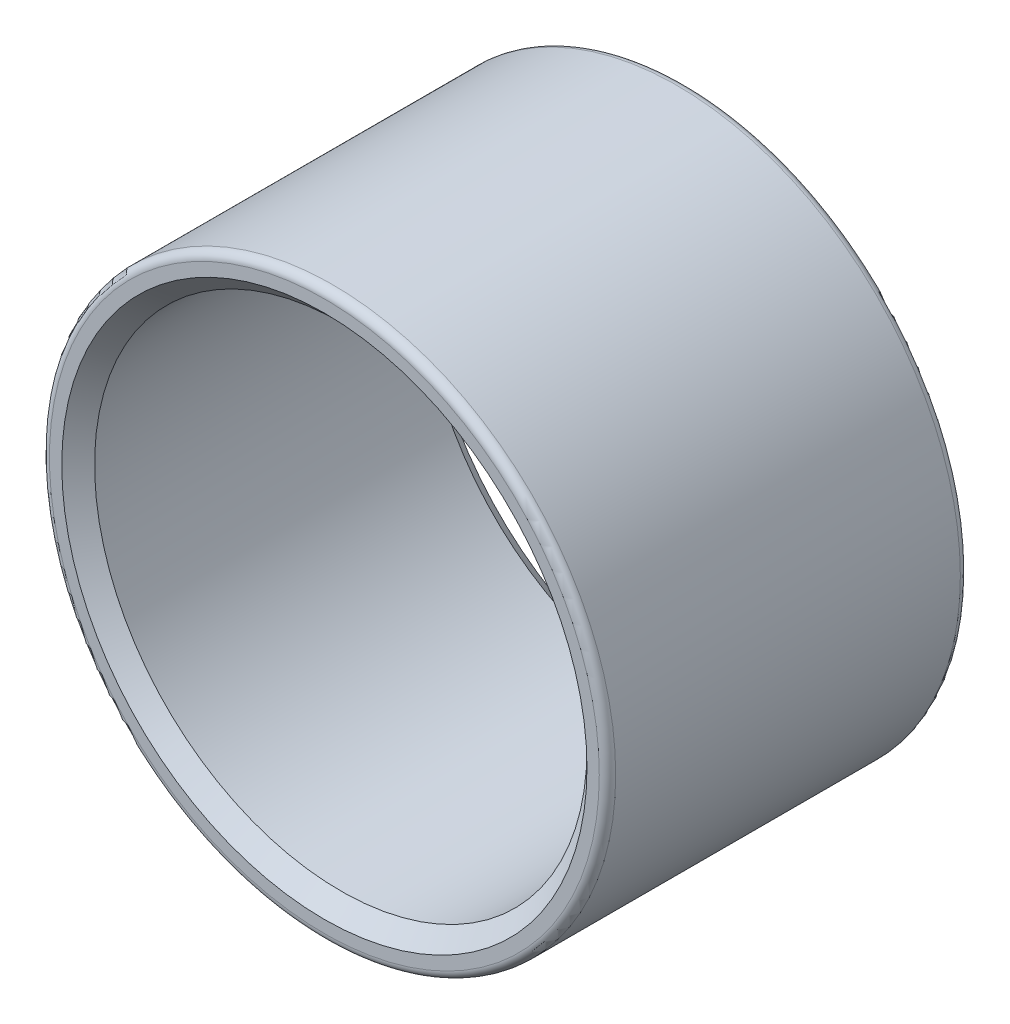
ISO-10303-21;
HEADER;
FILE_DESCRIPTION(('STEP AP214'),'2;1');
FILE_NAME('part.step','',(''),(''),'','','');
FILE_SCHEMA(('AUTOMOTIVE_DESIGN { 1 0 10303 214 1 1 1 1 }'));
ENDSEC;
DATA;
#1=APPLICATION_CONTEXT('core data for automotive mechanical design processes');
#2=APPLICATION_PROTOCOL_DEFINITION('international standard','automotive_design',2000,#1);
#3=PRODUCT_CONTEXT('',#1,'mechanical');
#4=PRODUCT('Part','Part','',(#3));
#5=PRODUCT_RELATED_PRODUCT_CATEGORY('part','',(#4));
#6=PRODUCT_DEFINITION_FORMATION('','',#4);
#7=PRODUCT_DEFINITION_CONTEXT('part definition',#1,'design');
#8=PRODUCT_DEFINITION('design','',#6,#7);
#9=PRODUCT_DEFINITION_SHAPE('','',#8);
#10=(LENGTH_UNIT() NAMED_UNIT(*) SI_UNIT(.MILLI.,.METRE.));
#11=(NAMED_UNIT(*) PLANE_ANGLE_UNIT() SI_UNIT($,.RADIAN.));
#12=(NAMED_UNIT(*) SI_UNIT($,.STERADIAN.) SOLID_ANGLE_UNIT());
#13=UNCERTAINTY_MEASURE_WITH_UNIT(LENGTH_MEASURE(1.E-05),#10,'distance_accuracy_value','');
#14=(GEOMETRIC_REPRESENTATION_CONTEXT(3) GLOBAL_UNCERTAINTY_ASSIGNED_CONTEXT((#13)) GLOBAL_UNIT_ASSIGNED_CONTEXT((#10,
#11,#12)) REPRESENTATION_CONTEXT('',''));
#15=CARTESIAN_POINT('',(0.,0.,0.));
#16=DIRECTION('',(0.,0.,1.));
#17=DIRECTION('',(1.,0.,0.));
#18=AXIS2_PLACEMENT_3D('',#15,#16,#17);
#19=CARTESIAN_POINT('',(0.,0.,22.));
#20=DIRECTION('',(0.,0.,1.));
#21=DIRECTION('',(1.,0.,0.));
#22=AXIS2_PLACEMENT_3D('',#19,#20,#21);
#23=PLANE('',#22);
#24=CARTESIAN_POINT('',(0.,0.,22.));
#25=DIRECTION('',(0.,0.,1.));
#26=DIRECTION('',(1.,0.,0.));
#27=AXIS2_PLACEMENT_3D('',#24,#25,#26);
#28=CIRCLE('',#27,16.);
#29=CARTESIAN_POINT('',(16.,0.,22.));
#30=VERTEX_POINT('',#29);
#31=EDGE_CURVE('E10',#30,#30,#28,.F.);
#32=ORIENTED_EDGE('',*,*,#31,.T.);
#33=EDGE_LOOP('',(#32));
#34=FACE_BOUND('',#33,.T.);
#35=CARTESIAN_POINT('',(0.,0.,22.));
#36=DIRECTION('',(0.,0.,1.));
#37=DIRECTION('',(1.,0.,0.));
#38=AXIS2_PLACEMENT_3D('',#35,#36,#37);
#39=CIRCLE('',#38,16.75);
#40=CARTESIAN_POINT('',(16.75,0.,22.));
#41=VERTEX_POINT('',#40);
#42=EDGE_CURVE('E54',#41,#41,#39,.T.);
#43=ORIENTED_EDGE('',*,*,#42,.T.);
#44=EDGE_LOOP('',(#43));
#45=FACE_BOUND('',#44,.T.);
#46=ADVANCED_FACE('F34',(#34,#45),#23,.T.);
#47=CARTESIAN_POINT('',(0.,0.,0.));
#48=DIRECTION('',(0.,0.,1.));
#49=DIRECTION('',(1.,0.,0.));
#50=AXIS2_PLACEMENT_3D('',#47,#48,#49);
#51=PLANE('',#50);
#52=CARTESIAN_POINT('',(0.,0.,0.));
#53=DIRECTION('',(0.,0.,1.));
#54=DIRECTION('',(1.,0.,0.));
#55=AXIS2_PLACEMENT_3D('',#52,#53,#54);
#56=CIRCLE('',#55,16.);
#57=CARTESIAN_POINT('',(16.,0.,0.));
#58=VERTEX_POINT('',#57);
#59=EDGE_CURVE('E49',#58,#58,#56,.T.);
#60=ORIENTED_EDGE('',*,*,#59,.T.);
#61=EDGE_LOOP('',(#60));
#62=FACE_BOUND('',#61,.T.);
#63=CARTESIAN_POINT('',(0.,0.,0.));
#64=DIRECTION('',(0.,0.,1.));
#65=DIRECTION('',(1.,0.,0.));
#66=AXIS2_PLACEMENT_3D('',#63,#64,#65);
#67=CIRCLE('',#66,16.75);
#68=CARTESIAN_POINT('',(16.75,0.,0.));
#69=VERTEX_POINT('',#68);
#70=EDGE_CURVE('E59',#69,#69,#67,.F.);
#71=ORIENTED_EDGE('',*,*,#70,.T.);
#72=EDGE_LOOP('',(#71));
#73=FACE_BOUND('',#72,.T.);
#74=ADVANCED_FACE('F76',(#62,#73),#51,.F.);
#75=CARTESIAN_POINT('',(0.,0.,22.));
#76=DIRECTION('',(0.,0.,-1.));
#77=DIRECTION('',(-1.,0.,0.));
#78=AXIS2_PLACEMENT_3D('',#75,#76,#77);
#79=CYLINDRICAL_SURFACE('',#78,17.25);
#80=CARTESIAN_POINT('',(0.,0.,0.5));
#81=DIRECTION('',(0.,0.,1.));
#82=DIRECTION('',(1.,0.,0.));
#83=AXIS2_PLACEMENT_3D('',#80,#81,#82);
#84=CIRCLE('',#83,17.25);
#85=CARTESIAN_POINT('',(17.25,0.,0.5));
#86=VERTEX_POINT('',#85);
#87=EDGE_CURVE('E63',#86,#86,#84,.T.);
#88=ORIENTED_EDGE('',*,*,#87,.T.);
#89=EDGE_LOOP('',(#88));
#90=FACE_BOUND('',#89,.T.);
#91=CARTESIAN_POINT('',(0.,0.,21.5));
#92=DIRECTION('',(0.,0.,1.));
#93=DIRECTION('',(1.,0.,0.));
#94=AXIS2_PLACEMENT_3D('',#91,#92,#93);
#95=CIRCLE('',#94,17.25);
#96=CARTESIAN_POINT('',(17.25,0.,21.5));
#97=VERTEX_POINT('',#96);
#98=EDGE_CURVE('E65',#97,#97,#95,.F.);
#99=ORIENTED_EDGE('',*,*,#98,.T.);
#100=EDGE_LOOP('',(#99));
#101=FACE_BOUND('',#100,.T.);
#102=ADVANCED_FACE('F40',(#90,#101),#79,.T.);
#103=CARTESIAN_POINT('',(0.,0.,22.));
#104=DIRECTION('',(0.,0.,-1.));
#105=DIRECTION('',(-1.,0.,0.));
#106=AXIS2_PLACEMENT_3D('',#103,#104,#105);
#107=CYLINDRICAL_SURFACE('',#106,15.);
#108=CARTESIAN_POINT('',(0.,0.,1.00000000000001));
#109=DIRECTION('',(0.,0.,1.));
#110=DIRECTION('',(1.,0.,0.));
#111=AXIS2_PLACEMENT_3D('',#108,#109,#110);
#112=CIRCLE('',#111,15.);
#113=CARTESIAN_POINT('',(15.,0.,1.00000000000001));
#114=VERTEX_POINT('',#113);
#115=EDGE_CURVE('E45',#114,#114,#112,.F.);
#116=ORIENTED_EDGE('',*,*,#115,.T.);
#117=EDGE_LOOP('',(#116));
#118=FACE_BOUND('',#117,.T.);
#119=CARTESIAN_POINT('',(0.,0.,21.));
#120=DIRECTION('',(0.,0.,1.));
#121=DIRECTION('',(1.,0.,0.));
#122=AXIS2_PLACEMENT_3D('',#119,#120,#121);
#123=CIRCLE('',#122,15.);
#124=CARTESIAN_POINT('',(15.,0.,21.));
#125=VERTEX_POINT('',#124);
#126=EDGE_CURVE('E46',#125,#125,#123,.T.);
#127=ORIENTED_EDGE('',*,*,#126,.T.);
#128=EDGE_LOOP('',(#127));
#129=FACE_BOUND('',#128,.T.);
#130=ADVANCED_FACE('F82',(#118,#129),#107,.F.);
#131=CARTESIAN_POINT('',(0.,0.,0.5));
#132=DIRECTION('',(0.,0.,1.));
#133=DIRECTION('',(1.,0.,0.));
#134=AXIS2_PLACEMENT_3D('',#131,#132,#133);
#135=TOROIDAL_SURFACE('',#134,16.75,0.5);
#136=ORIENTED_EDGE('',*,*,#70,.F.);
#137=EDGE_LOOP('',(#136));
#138=FACE_BOUND('',#137,.T.);
#139=ORIENTED_EDGE('',*,*,#87,.F.);
#140=EDGE_LOOP('',(#139));
#141=FACE_BOUND('',#140,.T.);
#142=ADVANCED_FACE('F75',(#138,#141),#135,.T.);
#143=CARTESIAN_POINT('',(0.,0.,21.5));
#144=DIRECTION('',(0.,0.,1.));
#145=DIRECTION('',(1.,0.,0.));
#146=AXIS2_PLACEMENT_3D('',#143,#144,#145);
#147=TOROIDAL_SURFACE('',#146,16.75,0.5);
#148=ORIENTED_EDGE('',*,*,#98,.F.);
#149=EDGE_LOOP('',(#148));
#150=FACE_BOUND('',#149,.T.);
#151=ORIENTED_EDGE('',*,*,#42,.F.);
#152=EDGE_LOOP('',(#151));
#153=FACE_BOUND('',#152,.T.);
#154=ADVANCED_FACE('F69',(#150,#153),#147,.T.);
#155=CARTESIAN_POINT('',(0.,0.,0.));
#156=DIRECTION('',(0.,0.,-1.));
#157=DIRECTION('',(-1.,0.,0.));
#158=AXIS2_PLACEMENT_3D('',#155,#156,#157);
#159=CONICAL_SURFACE('',#158,16.,0.785398163397445);
#160=ORIENTED_EDGE('',*,*,#115,.F.);
#161=EDGE_LOOP('',(#160));
#162=FACE_BOUND('',#161,.T.);
#163=ORIENTED_EDGE('',*,*,#59,.F.);
#164=EDGE_LOOP('',(#163));
#165=FACE_BOUND('',#164,.T.);
#166=ADVANCED_FACE('F71',(#162,#165),#159,.F.);
#167=CARTESIAN_POINT('',(0.,0.,21.));
#168=DIRECTION('',(0.,0.,1.));
#169=DIRECTION('',(1.,0.,0.));
#170=AXIS2_PLACEMENT_3D('',#167,#168,#169);
#171=CONICAL_SURFACE('',#170,15.,0.785398163397452);
#172=ORIENTED_EDGE('',*,*,#31,.F.);
#173=EDGE_LOOP('',(#172));
#174=FACE_BOUND('',#173,.T.);
#175=ORIENTED_EDGE('',*,*,#126,.F.);
#176=EDGE_LOOP('',(#175));
#177=FACE_BOUND('',#176,.T.);
#178=ADVANCED_FACE('F93',(#174,#177),#171,.F.);
#179=CLOSED_SHELL('',(#46,#74,#102,#130,#142,#154,#166,#178));
#180=MANIFOLD_SOLID_BREP('B2',#179);
#181=ADVANCED_BREP_SHAPE_REPRESENTATION('',(#18,#180),#14);
#182=SHAPE_DEFINITION_REPRESENTATION(#9,#181);
ENDSEC;
END-ISO-10303-21;
